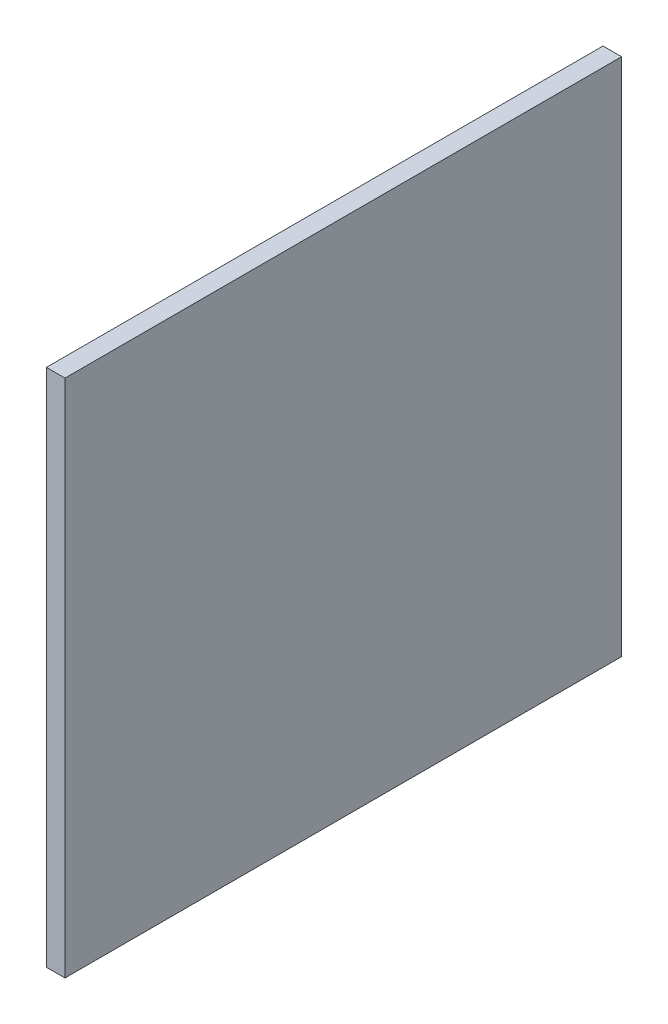
ISO-10303-21;
HEADER;
FILE_DESCRIPTION(('STEP AP214'),'2;1');
FILE_NAME('part.step','',(''),(''),'','','');
FILE_SCHEMA(('AUTOMOTIVE_DESIGN { 1 0 10303 214 1 1 1 1 }'));
ENDSEC;
DATA;
#1=APPLICATION_CONTEXT('core data for automotive mechanical design processes');
#2=APPLICATION_PROTOCOL_DEFINITION('international standard','automotive_design',2000,#1);
#3=PRODUCT_CONTEXT('',#1,'mechanical');
#4=PRODUCT('Part','Part','',(#3));
#5=PRODUCT_RELATED_PRODUCT_CATEGORY('part','',(#4));
#6=PRODUCT_DEFINITION_FORMATION('','',#4);
#7=PRODUCT_DEFINITION_CONTEXT('part definition',#1,'design');
#8=PRODUCT_DEFINITION('design','',#6,#7);
#9=PRODUCT_DEFINITION_SHAPE('','',#8);
#10=(LENGTH_UNIT() NAMED_UNIT(*) SI_UNIT(.MILLI.,.METRE.));
#11=(NAMED_UNIT(*) PLANE_ANGLE_UNIT() SI_UNIT($,.RADIAN.));
#12=(NAMED_UNIT(*) SI_UNIT($,.STERADIAN.) SOLID_ANGLE_UNIT());
#13=UNCERTAINTY_MEASURE_WITH_UNIT(LENGTH_MEASURE(1.E-05),#10,'distance_accuracy_value','');
#14=(GEOMETRIC_REPRESENTATION_CONTEXT(3) GLOBAL_UNCERTAINTY_ASSIGNED_CONTEXT((#13)) GLOBAL_UNIT_ASSIGNED_CONTEXT((#10,
#11,#12)) REPRESENTATION_CONTEXT('',''));
#15=CARTESIAN_POINT('',(0.,0.,0.));
#16=DIRECTION('',(0.,0.,1.));
#17=DIRECTION('',(1.,0.,0.));
#18=AXIS2_PLACEMENT_3D('',#15,#16,#17);
#19=CARTESIAN_POINT('',(25.,0.,0.));
#20=DIRECTION('',(0.,0.,-1.));
#21=DIRECTION('',(-1.,0.,0.));
#22=AXIS2_PLACEMENT_3D('',#19,#20,#21);
#23=PLANE('',#22);
#24=DIRECTION('',(0.,-1.,0.));
#25=VECTOR('',#24,1.);
#26=CARTESIAN_POINT('',(0.,0.,0.));
#27=LINE('',#26,#25);
#28=CARTESIAN_POINT('',(0.,700.,0.));
#29=VERTEX_POINT('',#28);
#30=CARTESIAN_POINT('',(0.,0.,0.));
#31=VERTEX_POINT('',#30);
#32=EDGE_CURVE('E96',#29,#31,#27,.T.);
#33=ORIENTED_EDGE('',*,*,#32,.T.);
#34=DIRECTION('',(-1.,0.,0.));
#35=VECTOR('',#34,1.);
#36=CARTESIAN_POINT('',(25.,0.,0.));
#37=LINE('',#36,#35);
#38=CARTESIAN_POINT('',(25.,0.,0.));
#39=VERTEX_POINT('',#38);
#40=EDGE_CURVE('E11',#39,#31,#37,.T.);
#41=ORIENTED_EDGE('',*,*,#40,.F.);
#42=DIRECTION('',(0.,-1.,0.));
#43=VECTOR('',#42,1.);
#44=CARTESIAN_POINT('',(25.,0.,0.));
#45=LINE('',#44,#43);
#46=CARTESIAN_POINT('',(25.,700.,0.));
#47=VERTEX_POINT('',#46);
#48=EDGE_CURVE('E84',#47,#39,#45,.T.);
#49=ORIENTED_EDGE('',*,*,#48,.F.);
#50=DIRECTION('',(-1.,0.,0.));
#51=VECTOR('',#50,1.);
#52=CARTESIAN_POINT('',(25.,700.,0.));
#53=LINE('',#52,#51);
#54=EDGE_CURVE('E92',#47,#29,#53,.T.);
#55=ORIENTED_EDGE('',*,*,#54,.T.);
#56=EDGE_LOOP('',(#33,#41,#49,#55));
#57=FACE_BOUND('',#56,.T.);
#58=ADVANCED_FACE('F33',(#57),#23,.F.);
#59=CARTESIAN_POINT('',(25.,0.,0.));
#60=DIRECTION('',(0.,1.,0.));
#61=DIRECTION('',(0.,0.,1.));
#62=AXIS2_PLACEMENT_3D('',#59,#60,#61);
#63=PLANE('',#62);
#64=DIRECTION('',(0.,0.,-1.));
#65=VECTOR('',#64,1.);
#66=CARTESIAN_POINT('',(0.,0.,0.));
#67=LINE('',#66,#65);
#68=CARTESIAN_POINT('',(0.,0.,-750.));
#69=VERTEX_POINT('',#68);
#70=EDGE_CURVE('E88',#31,#69,#67,.T.);
#71=ORIENTED_EDGE('',*,*,#70,.T.);
#72=DIRECTION('',(-1.,0.,0.));
#73=VECTOR('',#72,1.);
#74=CARTESIAN_POINT('',(25.,0.,-750.));
#75=LINE('',#74,#73);
#76=CARTESIAN_POINT('',(25.,0.,-750.));
#77=VERTEX_POINT('',#76);
#78=EDGE_CURVE('E41',#77,#69,#75,.T.);
#79=ORIENTED_EDGE('',*,*,#78,.F.);
#80=DIRECTION('',(0.,0.,-1.));
#81=VECTOR('',#80,1.);
#82=CARTESIAN_POINT('',(25.,0.,0.));
#83=LINE('',#82,#81);
#84=EDGE_CURVE('E79',#39,#77,#83,.T.);
#85=ORIENTED_EDGE('',*,*,#84,.F.);
#86=ORIENTED_EDGE('',*,*,#40,.T.);
#87=EDGE_LOOP('',(#71,#79,#85,#86));
#88=FACE_BOUND('',#87,.T.);
#89=ADVANCED_FACE('F87',(#88),#63,.F.);
#90=CARTESIAN_POINT('',(25.,0.,-750.));
#91=DIRECTION('',(0.,0.,1.));
#92=DIRECTION('',(1.,0.,0.));
#93=AXIS2_PLACEMENT_3D('',#90,#91,#92);
#94=PLANE('',#93);
#95=DIRECTION('',(0.,1.,0.));
#96=VECTOR('',#95,1.);
#97=CARTESIAN_POINT('',(0.,0.,-750.));
#98=LINE('',#97,#96);
#99=CARTESIAN_POINT('',(0.,700.,-750.));
#100=VERTEX_POINT('',#99);
#101=EDGE_CURVE('E66',#69,#100,#98,.T.);
#102=ORIENTED_EDGE('',*,*,#101,.T.);
#103=DIRECTION('',(-1.,0.,0.));
#104=VECTOR('',#103,1.);
#105=CARTESIAN_POINT('',(25.,700.,-750.));
#106=LINE('',#105,#104);
#107=CARTESIAN_POINT('',(25.,700.,-750.));
#108=VERTEX_POINT('',#107);
#109=EDGE_CURVE('E89',#108,#100,#106,.T.);
#110=ORIENTED_EDGE('',*,*,#109,.F.);
#111=DIRECTION('',(0.,1.,0.));
#112=VECTOR('',#111,1.);
#113=CARTESIAN_POINT('',(25.,0.,-750.));
#114=LINE('',#113,#112);
#115=EDGE_CURVE('E82',#77,#108,#114,.T.);
#116=ORIENTED_EDGE('',*,*,#115,.F.);
#117=ORIENTED_EDGE('',*,*,#78,.T.);
#118=EDGE_LOOP('',(#102,#110,#116,#117));
#119=FACE_BOUND('',#118,.T.);
#120=ADVANCED_FACE('F90',(#119),#94,.F.);
#121=CARTESIAN_POINT('',(25.,700.,0.));
#122=DIRECTION('',(0.,-1.,0.));
#123=DIRECTION('',(0.,0.,-1.));
#124=AXIS2_PLACEMENT_3D('',#121,#122,#123);
#125=PLANE('',#124);
#126=DIRECTION('',(0.,0.,1.));
#127=VECTOR('',#126,1.);
#128=CARTESIAN_POINT('',(0.,700.,0.));
#129=LINE('',#128,#127);
#130=EDGE_CURVE('E72',#100,#29,#129,.T.);
#131=ORIENTED_EDGE('',*,*,#130,.T.);
#132=ORIENTED_EDGE('',*,*,#54,.F.);
#133=DIRECTION('',(0.,0.,1.));
#134=VECTOR('',#133,1.);
#135=CARTESIAN_POINT('',(25.,700.,0.));
#136=LINE('',#135,#134);
#137=EDGE_CURVE('E49',#108,#47,#136,.T.);
#138=ORIENTED_EDGE('',*,*,#137,.F.);
#139=ORIENTED_EDGE('',*,*,#109,.T.);
#140=EDGE_LOOP('',(#131,#132,#138,#139));
#141=FACE_BOUND('',#140,.T.);
#142=ADVANCED_FACE('F103',(#141),#125,.F.);
#143=CARTESIAN_POINT('',(25.,0.,0.));
#144=DIRECTION('',(-1.,0.,0.));
#145=DIRECTION('',(0.,0.,1.));
#146=AXIS2_PLACEMENT_3D('',#143,#144,#145);
#147=PLANE('',#146);
#148=ORIENTED_EDGE('',*,*,#48,.T.);
#149=ORIENTED_EDGE('',*,*,#84,.T.);
#150=ORIENTED_EDGE('',*,*,#115,.T.);
#151=ORIENTED_EDGE('',*,*,#137,.T.);
#152=EDGE_LOOP('',(#148,#149,#150,#151));
#153=FACE_BOUND('',#152,.T.);
#154=ADVANCED_FACE('F80',(#153),#147,.F.);
#155=CARTESIAN_POINT('',(0.,0.,0.));
#156=DIRECTION('',(-1.,0.,0.));
#157=DIRECTION('',(0.,0.,1.));
#158=AXIS2_PLACEMENT_3D('',#155,#156,#157);
#159=PLANE('',#158);
#160=ORIENTED_EDGE('',*,*,#32,.F.);
#161=ORIENTED_EDGE('',*,*,#130,.F.);
#162=ORIENTED_EDGE('',*,*,#101,.F.);
#163=ORIENTED_EDGE('',*,*,#70,.F.);
#164=EDGE_LOOP('',(#160,#161,#162,#163));
#165=FACE_BOUND('',#164,.T.);
#166=ADVANCED_FACE('F106',(#165),#159,.T.);
#167=CLOSED_SHELL('',(#58,#89,#120,#142,#154,#166));
#168=MANIFOLD_SOLID_BREP('B2',#167);
#169=ADVANCED_BREP_SHAPE_REPRESENTATION('',(#18,#168),#14);
#170=SHAPE_DEFINITION_REPRESENTATION(#9,#169);
ENDSEC;
END-ISO-10303-21;
